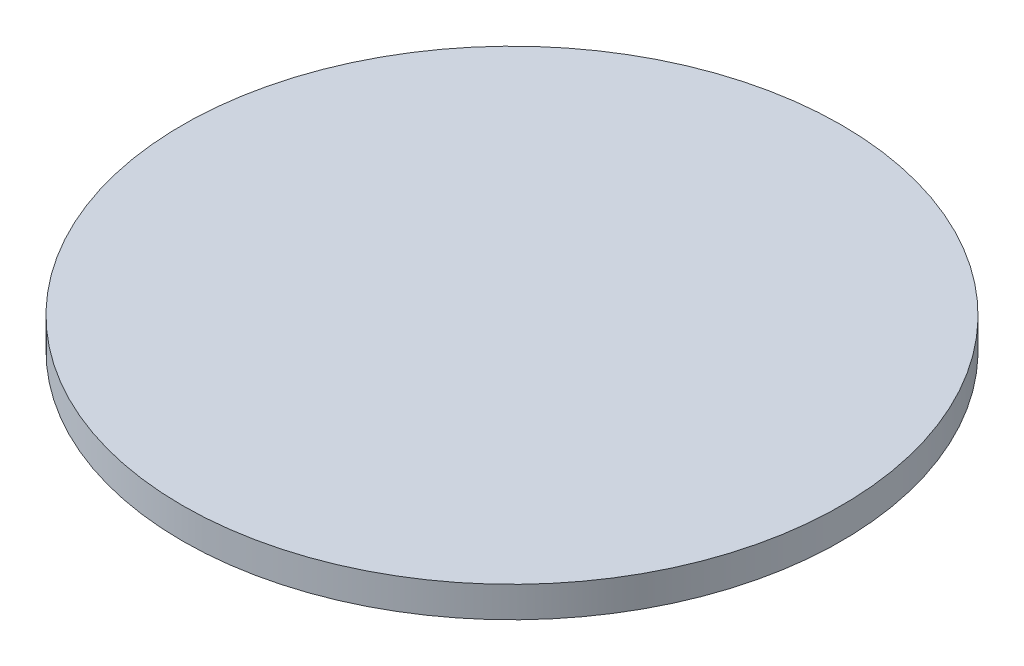
ISO-10303-21;
HEADER;
FILE_DESCRIPTION(('STEP AP214'),'2;1');
FILE_NAME('part.step','',(''),(''),'','','');
FILE_SCHEMA(('AUTOMOTIVE_DESIGN { 1 0 10303 214 1 1 1 1 }'));
ENDSEC;
DATA;
#1=APPLICATION_CONTEXT('core data for automotive mechanical design processes');
#2=APPLICATION_PROTOCOL_DEFINITION('international standard','automotive_design',2000,#1);
#3=PRODUCT_CONTEXT('',#1,'mechanical');
#4=PRODUCT('Part','Part','',(#3));
#5=PRODUCT_RELATED_PRODUCT_CATEGORY('part','',(#4));
#6=PRODUCT_DEFINITION_FORMATION('','',#4);
#7=PRODUCT_DEFINITION_CONTEXT('part definition',#1,'design');
#8=PRODUCT_DEFINITION('design','',#6,#7);
#9=PRODUCT_DEFINITION_SHAPE('','',#8);
#10=(LENGTH_UNIT() NAMED_UNIT(*) SI_UNIT(.MILLI.,.METRE.));
#11=(NAMED_UNIT(*) PLANE_ANGLE_UNIT() SI_UNIT($,.RADIAN.));
#12=(NAMED_UNIT(*) SI_UNIT($,.STERADIAN.) SOLID_ANGLE_UNIT());
#13=UNCERTAINTY_MEASURE_WITH_UNIT(LENGTH_MEASURE(1.E-05),#10,'distance_accuracy_value','');
#14=(GEOMETRIC_REPRESENTATION_CONTEXT(3) GLOBAL_UNCERTAINTY_ASSIGNED_CONTEXT((#13)) GLOBAL_UNIT_ASSIGNED_CONTEXT((#10,
#11,#12)) REPRESENTATION_CONTEXT('',''));
#15=CARTESIAN_POINT('',(0.,0.,0.));
#16=DIRECTION('',(0.,0.,1.));
#17=DIRECTION('',(1.,0.,0.));
#18=AXIS2_PLACEMENT_3D('',#15,#16,#17);
#19=CARTESIAN_POINT('',(0.,3.,0.));
#20=DIRECTION('',(0.,-1.,0.));
#21=DIRECTION('',(0.,0.,-1.));
#22=AXIS2_PLACEMENT_3D('',#19,#20,#21);
#23=CYLINDRICAL_SURFACE('',#22,32.1724534248049);
#24=CARTESIAN_POINT('',(0.,3.,0.));
#25=DIRECTION('',(0.,1.,0.));
#26=DIRECTION('',(0.,0.,1.));
#27=AXIS2_PLACEMENT_3D('',#24,#25,#26);
#28=CIRCLE('',#27,32.1724534248049);
#29=CARTESIAN_POINT('',(0.,3.,32.1724534248049));
#30=VERTEX_POINT('',#29);
#31=EDGE_CURVE('E10',#30,#30,#28,.T.);
#32=ORIENTED_EDGE('',*,*,#31,.F.);
#33=EDGE_LOOP('',(#32));
#34=FACE_BOUND('',#33,.T.);
#35=CARTESIAN_POINT('',(0.,0.,0.));
#36=DIRECTION('',(0.,1.,0.));
#37=DIRECTION('',(0.,0.,1.));
#38=AXIS2_PLACEMENT_3D('',#35,#36,#37);
#39=CIRCLE('',#38,32.1724534248049);
#40=CARTESIAN_POINT('',(0.,0.,32.1724534248049));
#41=VERTEX_POINT('',#40);
#42=EDGE_CURVE('E38',#41,#41,#39,.T.);
#43=ORIENTED_EDGE('',*,*,#42,.T.);
#44=EDGE_LOOP('',(#43));
#45=FACE_BOUND('',#44,.T.);
#46=ADVANCED_FACE('F35',(#34,#45),#23,.T.);
#47=CARTESIAN_POINT('',(0.,3.,0.));
#48=DIRECTION('',(0.,1.,0.));
#49=DIRECTION('',(0.,0.,1.));
#50=AXIS2_PLACEMENT_3D('',#47,#48,#49);
#51=PLANE('',#50);
#52=ORIENTED_EDGE('',*,*,#31,.T.);
#53=EDGE_LOOP('',(#52));
#54=FACE_BOUND('',#53,.T.);
#55=ADVANCED_FACE('F52',(#54),#51,.T.);
#56=CARTESIAN_POINT('',(0.,0.,0.));
#57=DIRECTION('',(0.,1.,0.));
#58=DIRECTION('',(0.,0.,1.));
#59=AXIS2_PLACEMENT_3D('',#56,#57,#58);
#60=PLANE('',#59);
#61=ORIENTED_EDGE('',*,*,#42,.F.);
#62=EDGE_LOOP('',(#61));
#63=FACE_BOUND('',#62,.T.);
#64=ADVANCED_FACE('F50',(#63),#60,.F.);
#65=CLOSED_SHELL('',(#46,#55,#64));
#66=MANIFOLD_SOLID_BREP('B2',#65);
#67=ADVANCED_BREP_SHAPE_REPRESENTATION('',(#18,#66),#14);
#68=SHAPE_DEFINITION_REPRESENTATION(#9,#67);
ENDSEC;
END-ISO-10303-21;
